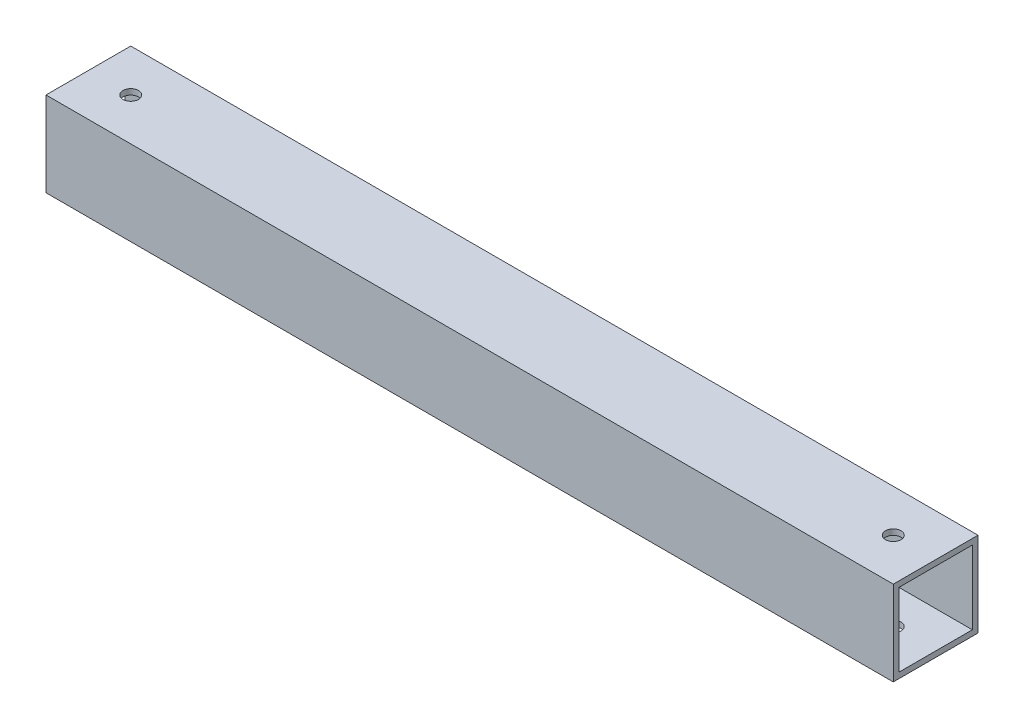
ISO-10303-21;
HEADER;
FILE_DESCRIPTION(('STEP AP214'),'2;1');
FILE_NAME('part.step','',(''),(''),'','','');
FILE_SCHEMA(('AUTOMOTIVE_DESIGN { 1 0 10303 214 1 1 1 1 }'));
ENDSEC;
DATA;
#1=APPLICATION_CONTEXT('core data for automotive mechanical design processes');
#2=APPLICATION_PROTOCOL_DEFINITION('international standard','automotive_design',2000,#1);
#3=PRODUCT_CONTEXT('',#1,'mechanical');
#4=PRODUCT('Part','Part','',(#3));
#5=PRODUCT_RELATED_PRODUCT_CATEGORY('part','',(#4));
#6=PRODUCT_DEFINITION_FORMATION('','',#4);
#7=PRODUCT_DEFINITION_CONTEXT('part definition',#1,'design');
#8=PRODUCT_DEFINITION('design','',#6,#7);
#9=PRODUCT_DEFINITION_SHAPE('','',#8);
#10=(LENGTH_UNIT() NAMED_UNIT(*) SI_UNIT(.MILLI.,.METRE.));
#11=(NAMED_UNIT(*) PLANE_ANGLE_UNIT() SI_UNIT($,.RADIAN.));
#12=(NAMED_UNIT(*) SI_UNIT($,.STERADIAN.) SOLID_ANGLE_UNIT());
#13=UNCERTAINTY_MEASURE_WITH_UNIT(LENGTH_MEASURE(1.E-05),#10,'distance_accuracy_value','');
#14=(GEOMETRIC_REPRESENTATION_CONTEXT(3) GLOBAL_UNCERTAINTY_ASSIGNED_CONTEXT((#13)) GLOBAL_UNIT_ASSIGNED_CONTEXT((#10,
#11,#12)) REPRESENTATION_CONTEXT('',''));
#15=CARTESIAN_POINT('',(0.,0.,0.));
#16=DIRECTION('',(0.,0.,1.));
#17=DIRECTION('',(1.,0.,0.));
#18=AXIS2_PLACEMENT_3D('',#15,#16,#17);
#19=CARTESIAN_POINT('',(150.,0.,0.));
#20=DIRECTION('',(-1.,0.,0.));
#21=DIRECTION('',(0.,0.,1.));
#22=AXIS2_PLACEMENT_3D('',#19,#20,#21);
#23=PLANE('',#22);
#24=DIRECTION('',(0.,-1.,0.));
#25=VECTOR('',#24,1.);
#26=CARTESIAN_POINT('',(150.,15.,15.));
#27=LINE('',#26,#25);
#28=CARTESIAN_POINT('',(150.,15.,15.));
#29=VERTEX_POINT('',#28);
#30=CARTESIAN_POINT('',(150.,-15.,15.));
#31=VERTEX_POINT('',#30);
#32=EDGE_CURVE('E156',#29,#31,#27,.T.);
#33=ORIENTED_EDGE('',*,*,#32,.T.);
#34=DIRECTION('',(0.,0.,-1.));
#35=VECTOR('',#34,1.);
#36=CARTESIAN_POINT('',(150.,-15.,-15.));
#37=LINE('',#36,#35);
#38=CARTESIAN_POINT('',(150.,-15.,-15.));
#39=VERTEX_POINT('',#38);
#40=EDGE_CURVE('E160',#31,#39,#37,.T.);
#41=ORIENTED_EDGE('',*,*,#40,.T.);
#42=DIRECTION('',(0.,1.,0.));
#43=VECTOR('',#42,1.);
#44=CARTESIAN_POINT('',(150.,15.,-15.));
#45=LINE('',#44,#43);
#46=CARTESIAN_POINT('',(150.,15.,-15.));
#47=VERTEX_POINT('',#46);
#48=EDGE_CURVE('E164',#39,#47,#45,.T.);
#49=ORIENTED_EDGE('',*,*,#48,.T.);
#50=DIRECTION('',(0.,0.,1.));
#51=VECTOR('',#50,1.);
#52=CARTESIAN_POINT('',(150.,15.,-15.));
#53=LINE('',#52,#51);
#54=EDGE_CURVE('E167',#47,#29,#53,.T.);
#55=ORIENTED_EDGE('',*,*,#54,.T.);
#56=EDGE_LOOP('',(#33,#41,#49,#55));
#57=FACE_BOUND('',#56,.T.);
#58=DIRECTION('',(0.,1.,0.));
#59=VECTOR('',#58,1.);
#60=CARTESIAN_POINT('',(150.,13.,-13.));
#61=LINE('',#60,#59);
#62=CARTESIAN_POINT('',(150.,-13.,-13.));
#63=VERTEX_POINT('',#62);
#64=CARTESIAN_POINT('',(150.,13.,-13.));
#65=VERTEX_POINT('',#64);
#66=EDGE_CURVE('E106',#63,#65,#61,.T.);
#67=ORIENTED_EDGE('',*,*,#66,.F.);
#68=DIRECTION('',(0.,0.,-1.));
#69=VECTOR('',#68,1.);
#70=CARTESIAN_POINT('',(150.,-13.,13.));
#71=LINE('',#70,#69);
#72=CARTESIAN_POINT('',(150.,-13.,13.));
#73=VERTEX_POINT('',#72);
#74=EDGE_CURVE('E132',#73,#63,#71,.T.);
#75=ORIENTED_EDGE('',*,*,#74,.F.);
#76=DIRECTION('',(0.,-1.,0.));
#77=VECTOR('',#76,1.);
#78=CARTESIAN_POINT('',(150.,13.,13.));
#79=LINE('',#78,#77);
#80=CARTESIAN_POINT('',(150.,13.,13.));
#81=VERTEX_POINT('',#80);
#82=EDGE_CURVE('E128',#81,#73,#79,.T.);
#83=ORIENTED_EDGE('',*,*,#82,.F.);
#84=DIRECTION('',(0.,0.,1.));
#85=VECTOR('',#84,1.);
#86=CARTESIAN_POINT('',(150.,13.,13.));
#87=LINE('',#86,#85);
#88=EDGE_CURVE('E115',#65,#81,#87,.T.);
#89=ORIENTED_EDGE('',*,*,#88,.F.);
#90=EDGE_LOOP('',(#67,#75,#83,#89));
#91=FACE_BOUND('',#90,.T.);
#92=ADVANCED_FACE('F38',(#57,#91),#23,.F.);
#93=CARTESIAN_POINT('',(-150.,0.,0.));
#94=DIRECTION('',(-1.,0.,0.));
#95=DIRECTION('',(0.,0.,1.));
#96=AXIS2_PLACEMENT_3D('',#93,#94,#95);
#97=PLANE('',#96);
#98=DIRECTION('',(0.,-1.,0.));
#99=VECTOR('',#98,1.);
#100=CARTESIAN_POINT('',(-150.,15.,15.));
#101=LINE('',#100,#99);
#102=CARTESIAN_POINT('',(-150.,15.,15.));
#103=VERTEX_POINT('',#102);
#104=CARTESIAN_POINT('',(-150.,-15.,15.));
#105=VERTEX_POINT('',#104);
#106=EDGE_CURVE('E124',#103,#105,#101,.T.);
#107=ORIENTED_EDGE('',*,*,#106,.F.);
#108=DIRECTION('',(0.,0.,1.));
#109=VECTOR('',#108,1.);
#110=CARTESIAN_POINT('',(-150.,15.,-15.));
#111=LINE('',#110,#109);
#112=CARTESIAN_POINT('',(-150.,15.,-15.));
#113=VERTEX_POINT('',#112);
#114=EDGE_CURVE('E161',#113,#103,#111,.T.);
#115=ORIENTED_EDGE('',*,*,#114,.F.);
#116=DIRECTION('',(0.,1.,0.));
#117=VECTOR('',#116,1.);
#118=CARTESIAN_POINT('',(-150.,15.,-15.));
#119=LINE('',#118,#117);
#120=CARTESIAN_POINT('',(-150.,-15.,-15.));
#121=VERTEX_POINT('',#120);
#122=EDGE_CURVE('E177',#121,#113,#119,.T.);
#123=ORIENTED_EDGE('',*,*,#122,.F.);
#124=DIRECTION('',(0.,0.,-1.));
#125=VECTOR('',#124,1.);
#126=CARTESIAN_POINT('',(-150.,-15.,-15.));
#127=LINE('',#126,#125);
#128=EDGE_CURVE('E174',#105,#121,#127,.T.);
#129=ORIENTED_EDGE('',*,*,#128,.F.);
#130=EDGE_LOOP('',(#107,#115,#123,#129));
#131=FACE_BOUND('',#130,.T.);
#132=DIRECTION('',(0.,0.,-1.));
#133=VECTOR('',#132,1.);
#134=CARTESIAN_POINT('',(-150.,-13.,13.));
#135=LINE('',#134,#133);
#136=CARTESIAN_POINT('',(-150.,-13.,13.));
#137=VERTEX_POINT('',#136);
#138=CARTESIAN_POINT('',(-150.,-13.,-13.));
#139=VERTEX_POINT('',#138);
#140=EDGE_CURVE('E116',#137,#139,#135,.T.);
#141=ORIENTED_EDGE('',*,*,#140,.T.);
#142=DIRECTION('',(0.,1.,0.));
#143=VECTOR('',#142,1.);
#144=CARTESIAN_POINT('',(-150.,13.,-13.));
#145=LINE('',#144,#143);
#146=CARTESIAN_POINT('',(-150.,13.,-13.));
#147=VERTEX_POINT('',#146);
#148=EDGE_CURVE('E64',#139,#147,#145,.T.);
#149=ORIENTED_EDGE('',*,*,#148,.T.);
#150=DIRECTION('',(0.,0.,1.));
#151=VECTOR('',#150,1.);
#152=CARTESIAN_POINT('',(-150.,13.,13.));
#153=LINE('',#152,#151);
#154=CARTESIAN_POINT('',(-150.,13.,13.));
#155=VERTEX_POINT('',#154);
#156=EDGE_CURVE('E122',#147,#155,#153,.T.);
#157=ORIENTED_EDGE('',*,*,#156,.T.);
#158=DIRECTION('',(0.,-1.,0.));
#159=VECTOR('',#158,1.);
#160=CARTESIAN_POINT('',(-150.,13.,13.));
#161=LINE('',#160,#159);
#162=EDGE_CURVE('E143',#155,#137,#161,.T.);
#163=ORIENTED_EDGE('',*,*,#162,.T.);
#164=EDGE_LOOP('',(#141,#149,#157,#163));
#165=FACE_BOUND('',#164,.T.);
#166=ADVANCED_FACE('F238',(#131,#165),#97,.T.);
#167=CARTESIAN_POINT('',(150.,15.,15.));
#168=DIRECTION('',(0.,0.,-1.));
#169=DIRECTION('',(0.,1.,0.));
#170=AXIS2_PLACEMENT_3D('',#167,#168,#169);
#171=PLANE('',#170);
#172=ORIENTED_EDGE('',*,*,#106,.T.);
#173=DIRECTION('',(-1.,0.,0.));
#174=VECTOR('',#173,1.);
#175=CARTESIAN_POINT('',(150.,-15.,15.));
#176=LINE('',#175,#174);
#177=EDGE_CURVE('E11',#31,#105,#176,.T.);
#178=ORIENTED_EDGE('',*,*,#177,.F.);
#179=ORIENTED_EDGE('',*,*,#32,.F.);
#180=DIRECTION('',(-1.,0.,0.));
#181=VECTOR('',#180,1.);
#182=CARTESIAN_POINT('',(150.,15.,15.));
#183=LINE('',#182,#181);
#184=EDGE_CURVE('E170',#29,#103,#183,.T.);
#185=ORIENTED_EDGE('',*,*,#184,.T.);
#186=EDGE_LOOP('',(#172,#178,#179,#185));
#187=FACE_BOUND('',#186,.T.);
#188=ADVANCED_FACE('F40',(#187),#171,.F.);
#189=CARTESIAN_POINT('',(150.,-15.,-15.));
#190=DIRECTION('',(0.,1.,0.));
#191=DIRECTION('',(0.,0.,1.));
#192=AXIS2_PLACEMENT_3D('',#189,#190,#191);
#193=PLANE('',#192);
#194=CARTESIAN_POINT('',(-135.,-15.,0.));
#195=DIRECTION('',(0.,-1.,0.));
#196=DIRECTION('',(0.,0.,1.));
#197=AXIS2_PLACEMENT_3D('',#194,#195,#196);
#198=CIRCLE('',#197,2.75000000000001);
#199=CARTESIAN_POINT('',(-135.,-15.,2.75000000000001));
#200=VERTEX_POINT('',#199);
#201=EDGE_CURVE('E213',#200,#200,#198,.T.);
#202=ORIENTED_EDGE('',*,*,#201,.F.);
#203=EDGE_LOOP('',(#202));
#204=FACE_BOUND('',#203,.T.);
#205=CARTESIAN_POINT('',(135.,-15.,0.));
#206=DIRECTION('',(0.,1.,0.));
#207=DIRECTION('',(0.,0.,1.));
#208=AXIS2_PLACEMENT_3D('',#205,#206,#207);
#209=CIRCLE('',#208,2.75000000000001);
#210=CARTESIAN_POINT('',(135.,-15.,2.75000000000001));
#211=VERTEX_POINT('',#210);
#212=EDGE_CURVE('E194',#211,#211,#209,.T.);
#213=ORIENTED_EDGE('',*,*,#212,.T.);
#214=EDGE_LOOP('',(#213));
#215=FACE_BOUND('',#214,.T.);
#216=ORIENTED_EDGE('',*,*,#128,.T.);
#217=DIRECTION('',(-1.,0.,0.));
#218=VECTOR('',#217,1.);
#219=CARTESIAN_POINT('',(150.,-15.,-15.));
#220=LINE('',#219,#218);
#221=EDGE_CURVE('E48',#39,#121,#220,.T.);
#222=ORIENTED_EDGE('',*,*,#221,.F.);
#223=ORIENTED_EDGE('',*,*,#40,.F.);
#224=ORIENTED_EDGE('',*,*,#177,.T.);
#225=EDGE_LOOP('',(#216,#222,#223,#224));
#226=FACE_BOUND('',#225,.T.);
#227=ADVANCED_FACE('F253',(#204,#215,#226),#193,.F.);
#228=CARTESIAN_POINT('',(150.,15.,-15.));
#229=DIRECTION('',(0.,0.,1.));
#230=DIRECTION('',(0.,-1.,0.));
#231=AXIS2_PLACEMENT_3D('',#228,#229,#230);
#232=PLANE('',#231);
#233=ORIENTED_EDGE('',*,*,#122,.T.);
#234=DIRECTION('',(-1.,0.,0.));
#235=VECTOR('',#234,1.);
#236=CARTESIAN_POINT('',(150.,15.,-15.));
#237=LINE('',#236,#235);
#238=EDGE_CURVE('E185',#47,#113,#237,.T.);
#239=ORIENTED_EDGE('',*,*,#238,.F.);
#240=ORIENTED_EDGE('',*,*,#48,.F.);
#241=ORIENTED_EDGE('',*,*,#221,.T.);
#242=EDGE_LOOP('',(#233,#239,#240,#241));
#243=FACE_BOUND('',#242,.T.);
#244=ADVANCED_FACE('F251',(#243),#232,.F.);
#245=CARTESIAN_POINT('',(150.,15.,-15.));
#246=DIRECTION('',(0.,-1.,0.));
#247=DIRECTION('',(0.,0.,-1.));
#248=AXIS2_PLACEMENT_3D('',#245,#246,#247);
#249=PLANE('',#248);
#250=CARTESIAN_POINT('',(-135.,15.,0.));
#251=DIRECTION('',(0.,-1.,0.));
#252=DIRECTION('',(0.,0.,1.));
#253=AXIS2_PLACEMENT_3D('',#250,#251,#252);
#254=CIRCLE('',#253,2.75000000000001);
#255=CARTESIAN_POINT('',(-135.,15.,2.75000000000001));
#256=VERTEX_POINT('',#255);
#257=EDGE_CURVE('E217',#256,#256,#254,.T.);
#258=ORIENTED_EDGE('',*,*,#257,.T.);
#259=EDGE_LOOP('',(#258));
#260=FACE_BOUND('',#259,.T.);
#261=CARTESIAN_POINT('',(135.,15.,0.));
#262=DIRECTION('',(0.,1.,0.));
#263=DIRECTION('',(0.,0.,1.));
#264=AXIS2_PLACEMENT_3D('',#261,#262,#263);
#265=CIRCLE('',#264,2.75000000000001);
#266=CARTESIAN_POINT('',(135.,15.,2.75000000000001));
#267=VERTEX_POINT('',#266);
#268=EDGE_CURVE('E201',#267,#267,#265,.T.);
#269=ORIENTED_EDGE('',*,*,#268,.F.);
#270=EDGE_LOOP('',(#269));
#271=FACE_BOUND('',#270,.T.);
#272=ORIENTED_EDGE('',*,*,#114,.T.);
#273=ORIENTED_EDGE('',*,*,#184,.F.);
#274=ORIENTED_EDGE('',*,*,#54,.F.);
#275=ORIENTED_EDGE('',*,*,#238,.T.);
#276=EDGE_LOOP('',(#272,#273,#274,#275));
#277=FACE_BOUND('',#276,.T.);
#278=ADVANCED_FACE('F222',(#260,#271,#277),#249,.F.);
#279=CARTESIAN_POINT('',(150.,13.,-13.));
#280=DIRECTION('',(0.,0.,1.));
#281=DIRECTION('',(1.,0.,0.));
#282=AXIS2_PLACEMENT_3D('',#279,#280,#281);
#283=PLANE('',#282);
#284=ORIENTED_EDGE('',*,*,#148,.F.);
#285=DIRECTION('',(-1.,0.,0.));
#286=VECTOR('',#285,1.);
#287=CARTESIAN_POINT('',(150.,-13.,-13.));
#288=LINE('',#287,#286);
#289=EDGE_CURVE('E110',#63,#139,#288,.T.);
#290=ORIENTED_EDGE('',*,*,#289,.F.);
#291=ORIENTED_EDGE('',*,*,#66,.T.);
#292=DIRECTION('',(-1.,0.,0.));
#293=VECTOR('',#292,1.);
#294=CARTESIAN_POINT('',(150.,13.,-13.));
#295=LINE('',#294,#293);
#296=EDGE_CURVE('E109',#65,#147,#295,.T.);
#297=ORIENTED_EDGE('',*,*,#296,.T.);
#298=EDGE_LOOP('',(#284,#290,#291,#297));
#299=FACE_BOUND('',#298,.T.);
#300=ADVANCED_FACE('F108',(#299),#283,.T.);
#301=CARTESIAN_POINT('',(150.,13.,13.));
#302=DIRECTION('',(0.,-1.,0.));
#303=DIRECTION('',(0.,0.,-1.));
#304=AXIS2_PLACEMENT_3D('',#301,#302,#303);
#305=PLANE('',#304);
#306=CARTESIAN_POINT('',(-135.,13.,0.));
#307=DIRECTION('',(0.,-1.,0.));
#308=DIRECTION('',(0.,0.,-1.));
#309=AXIS2_PLACEMENT_3D('',#306,#307,#308);
#310=CIRCLE('',#309,2.75000000000001);
#311=CARTESIAN_POINT('',(-135.,13.,-2.75000000000001));
#312=VERTEX_POINT('',#311);
#313=EDGE_CURVE('E207',#312,#312,#310,.F.);
#314=ORIENTED_EDGE('',*,*,#313,.T.);
#315=EDGE_LOOP('',(#314));
#316=FACE_BOUND('',#315,.T.);
#317=CARTESIAN_POINT('',(135.,13.,0.));
#318=DIRECTION('',(0.,-1.,0.));
#319=DIRECTION('',(0.,0.,-1.));
#320=AXIS2_PLACEMENT_3D('',#317,#318,#319);
#321=CIRCLE('',#320,2.75000000000001);
#322=CARTESIAN_POINT('',(135.,13.,-2.75000000000001));
#323=VERTEX_POINT('',#322);
#324=EDGE_CURVE('E140',#323,#323,#321,.T.);
#325=ORIENTED_EDGE('',*,*,#324,.F.);
#326=EDGE_LOOP('',(#325));
#327=FACE_BOUND('',#326,.T.);
#328=ORIENTED_EDGE('',*,*,#156,.F.);
#329=ORIENTED_EDGE('',*,*,#296,.F.);
#330=ORIENTED_EDGE('',*,*,#88,.T.);
#331=DIRECTION('',(-1.,0.,0.));
#332=VECTOR('',#331,1.);
#333=CARTESIAN_POINT('',(150.,13.,13.));
#334=LINE('',#333,#332);
#335=EDGE_CURVE('E125',#81,#155,#334,.T.);
#336=ORIENTED_EDGE('',*,*,#335,.T.);
#337=EDGE_LOOP('',(#328,#329,#330,#336));
#338=FACE_BOUND('',#337,.T.);
#339=ADVANCED_FACE('F119',(#316,#327,#338),#305,.T.);
#340=CARTESIAN_POINT('',(150.,13.,13.));
#341=DIRECTION('',(0.,0.,-1.));
#342=DIRECTION('',(-1.,0.,0.));
#343=AXIS2_PLACEMENT_3D('',#340,#341,#342);
#344=PLANE('',#343);
#345=ORIENTED_EDGE('',*,*,#162,.F.);
#346=ORIENTED_EDGE('',*,*,#335,.F.);
#347=ORIENTED_EDGE('',*,*,#82,.T.);
#348=DIRECTION('',(-1.,0.,0.));
#349=VECTOR('',#348,1.);
#350=CARTESIAN_POINT('',(150.,-13.,13.));
#351=LINE('',#350,#349);
#352=EDGE_CURVE('E56',#73,#137,#351,.T.);
#353=ORIENTED_EDGE('',*,*,#352,.T.);
#354=EDGE_LOOP('',(#345,#346,#347,#353));
#355=FACE_BOUND('',#354,.T.);
#356=ADVANCED_FACE('F280',(#355),#344,.T.);
#357=CARTESIAN_POINT('',(150.,-13.,13.));
#358=DIRECTION('',(0.,1.,0.));
#359=DIRECTION('',(0.,0.,1.));
#360=AXIS2_PLACEMENT_3D('',#357,#358,#359);
#361=PLANE('',#360);
#362=CARTESIAN_POINT('',(-135.,-13.,0.));
#363=DIRECTION('',(0.,1.,0.));
#364=DIRECTION('',(0.,0.,1.));
#365=AXIS2_PLACEMENT_3D('',#362,#363,#364);
#366=CIRCLE('',#365,2.75000000000001);
#367=CARTESIAN_POINT('',(-135.,-13.,2.75000000000001));
#368=VERTEX_POINT('',#367);
#369=EDGE_CURVE('E42',#368,#368,#366,.F.);
#370=ORIENTED_EDGE('',*,*,#369,.T.);
#371=EDGE_LOOP('',(#370));
#372=FACE_BOUND('',#371,.T.);
#373=CARTESIAN_POINT('',(135.,-13.,0.));
#374=DIRECTION('',(0.,1.,0.));
#375=DIRECTION('',(0.,0.,1.));
#376=AXIS2_PLACEMENT_3D('',#373,#374,#375);
#377=CIRCLE('',#376,2.75000000000001);
#378=CARTESIAN_POINT('',(135.,-13.,2.75000000000001));
#379=VERTEX_POINT('',#378);
#380=EDGE_CURVE('E191',#379,#379,#377,.T.);
#381=ORIENTED_EDGE('',*,*,#380,.F.);
#382=EDGE_LOOP('',(#381));
#383=FACE_BOUND('',#382,.T.);
#384=ORIENTED_EDGE('',*,*,#140,.F.);
#385=ORIENTED_EDGE('',*,*,#352,.F.);
#386=ORIENTED_EDGE('',*,*,#74,.T.);
#387=ORIENTED_EDGE('',*,*,#289,.T.);
#388=EDGE_LOOP('',(#384,#385,#386,#387));
#389=FACE_BOUND('',#388,.T.);
#390=ADVANCED_FACE('F277',(#372,#383,#389),#361,.T.);
#391=CARTESIAN_POINT('',(135.,-15.,0.));
#392=DIRECTION('',(0.,1.,0.));
#393=DIRECTION('',(0.,0.,1.));
#394=AXIS2_PLACEMENT_3D('',#391,#392,#393);
#395=CYLINDRICAL_SURFACE('',#394,2.75000000000001);
#396=ORIENTED_EDGE('',*,*,#380,.T.);
#397=EDGE_LOOP('',(#396));
#398=FACE_BOUND('',#397,.T.);
#399=ORIENTED_EDGE('',*,*,#212,.F.);
#400=EDGE_LOOP('',(#399));
#401=FACE_BOUND('',#400,.T.);
#402=ADVANCED_FACE('F279',(#398,#401),#395,.F.);
#403=ORIENTED_EDGE('',*,*,#324,.T.);
#404=EDGE_LOOP('',(#403));
#405=FACE_BOUND('',#404,.T.);
#406=ORIENTED_EDGE('',*,*,#268,.T.);
#407=EDGE_LOOP('',(#406));
#408=FACE_BOUND('',#407,.T.);
#409=ADVANCED_FACE('F233',(#405,#408),#395,.F.);
#410=CARTESIAN_POINT('',(-135.,-15.,0.));
#411=DIRECTION('',(0.,1.,0.));
#412=DIRECTION('',(0.,0.,1.));
#413=AXIS2_PLACEMENT_3D('',#410,#411,#412);
#414=CYLINDRICAL_SURFACE('',#413,2.75000000000001);
#415=ORIENTED_EDGE('',*,*,#369,.F.);
#416=EDGE_LOOP('',(#415));
#417=FACE_BOUND('',#416,.T.);
#418=ORIENTED_EDGE('',*,*,#201,.T.);
#419=EDGE_LOOP('',(#418));
#420=FACE_BOUND('',#419,.T.);
#421=ADVANCED_FACE('F227',(#417,#420),#414,.F.);
#422=ORIENTED_EDGE('',*,*,#313,.F.);
#423=EDGE_LOOP('',(#422));
#424=FACE_BOUND('',#423,.T.);
#425=ORIENTED_EDGE('',*,*,#257,.F.);
#426=EDGE_LOOP('',(#425));
#427=FACE_BOUND('',#426,.T.);
#428=ADVANCED_FACE('F225',(#424,#427),#414,.F.);
#429=CLOSED_SHELL('',(#92,#166,#188,#227,#244,#278,#300,#339,#356,#390,#402,#409,#421,#428));
#430=MANIFOLD_SOLID_BREP('B2',#429);
#431=ADVANCED_BREP_SHAPE_REPRESENTATION('',(#18,#430),#14);
#432=SHAPE_DEFINITION_REPRESENTATION(#9,#431);
ENDSEC;
END-ISO-10303-21;
